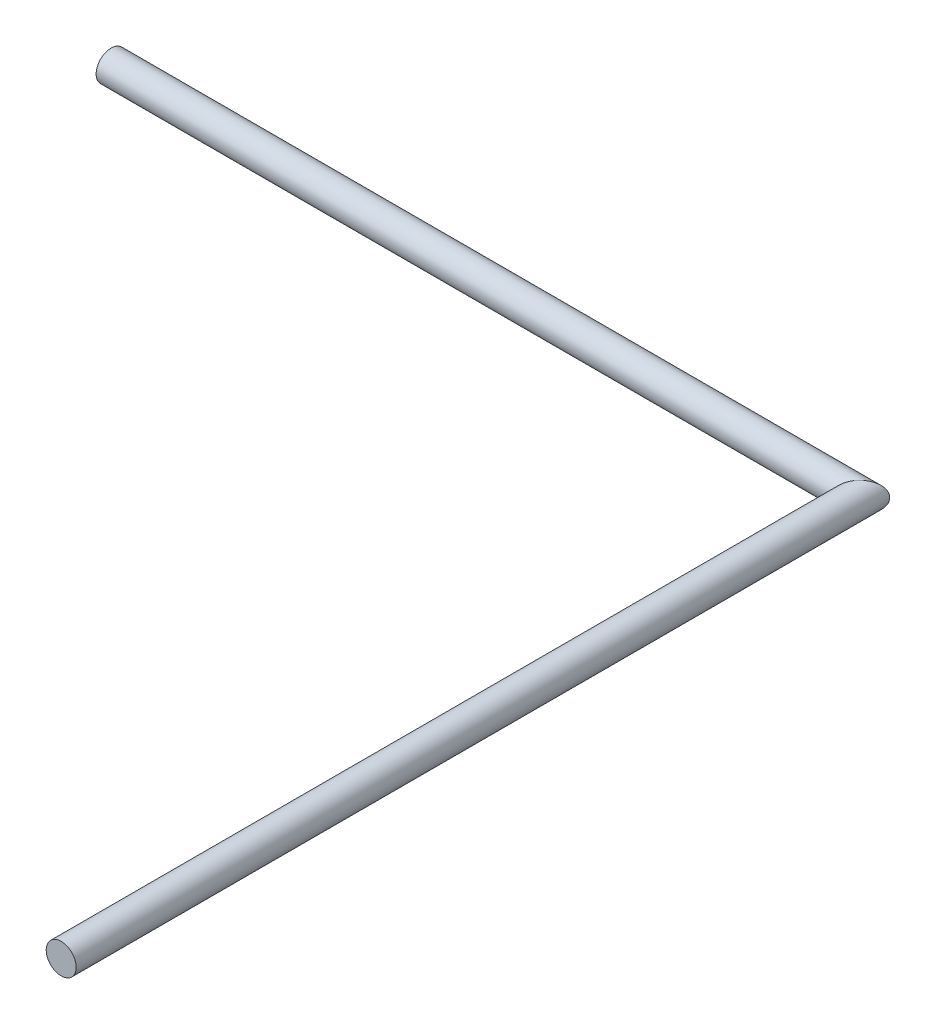
ISO-10303-21;
HEADER;
FILE_DESCRIPTION(('STEP AP214'),'2;1');
FILE_NAME('part.step','',(''),(''),'','','');
FILE_SCHEMA(('AUTOMOTIVE_DESIGN { 1 0 10303 214 1 1 1 1 }'));
ENDSEC;
DATA;
#1=APPLICATION_CONTEXT('core data for automotive mechanical design processes');
#2=APPLICATION_PROTOCOL_DEFINITION('international standard','automotive_design',2000,#1);
#3=PRODUCT_CONTEXT('',#1,'mechanical');
#4=PRODUCT('Part','Part','',(#3));
#5=PRODUCT_RELATED_PRODUCT_CATEGORY('part','',(#4));
#6=PRODUCT_DEFINITION_FORMATION('','',#4);
#7=PRODUCT_DEFINITION_CONTEXT('part definition',#1,'design');
#8=PRODUCT_DEFINITION('design','',#6,#7);
#9=PRODUCT_DEFINITION_SHAPE('','',#8);
#10=(LENGTH_UNIT() NAMED_UNIT(*) SI_UNIT(.MILLI.,.METRE.));
#11=(NAMED_UNIT(*) PLANE_ANGLE_UNIT() SI_UNIT($,.RADIAN.));
#12=(NAMED_UNIT(*) SI_UNIT($,.STERADIAN.) SOLID_ANGLE_UNIT());
#13=UNCERTAINTY_MEASURE_WITH_UNIT(LENGTH_MEASURE(1.E-05),#10,'distance_accuracy_value','');
#14=(GEOMETRIC_REPRESENTATION_CONTEXT(3) GLOBAL_UNCERTAINTY_ASSIGNED_CONTEXT((#13)) GLOBAL_UNIT_ASSIGNED_CONTEXT((#10,
#11,#12)) REPRESENTATION_CONTEXT('',''));
#15=CARTESIAN_POINT('',(0.,0.,0.));
#16=DIRECTION('',(0.,0.,1.));
#17=DIRECTION('',(1.,0.,0.));
#18=AXIS2_PLACEMENT_3D('',#15,#16,#17);
#19=CARTESIAN_POINT('',(150.,0.,160.));
#20=DIRECTION('',(0.,0.,1.));
#21=DIRECTION('',(1.,0.,0.));
#22=AXIS2_PLACEMENT_3D('',#19,#20,#21);
#23=PLANE('',#22);
#24=CARTESIAN_POINT('',(150.,0.,160.));
#25=DIRECTION('',(0.,0.,1.));
#26=DIRECTION('',(1.,0.,0.));
#27=AXIS2_PLACEMENT_3D('',#24,#25,#26);
#28=CIRCLE('',#27,3.);
#29=CARTESIAN_POINT('',(153.,0.,160.));
#30=VERTEX_POINT('',#29);
#31=EDGE_CURVE('E40',#30,#30,#28,.T.);
#32=ORIENTED_EDGE('',*,*,#31,.T.);
#33=EDGE_LOOP('',(#32));
#34=FACE_BOUND('',#33,.T.);
#35=ADVANCED_FACE('F37',(#34),#23,.T.);
#36=CARTESIAN_POINT('',(0.,0.,0.));
#37=DIRECTION('',(1.,0.,0.));
#38=DIRECTION('',(0.,0.,-1.));
#39=AXIS2_PLACEMENT_3D('',#36,#37,#38);
#40=PLANE('',#39);
#41=CARTESIAN_POINT('',(0.,0.,0.));
#42=DIRECTION('',(1.,0.,0.));
#43=DIRECTION('',(0.,0.,-1.));
#44=AXIS2_PLACEMENT_3D('',#41,#42,#43);
#45=CIRCLE('',#44,3.);
#46=CARTESIAN_POINT('',(0.,0.,-3.));
#47=VERTEX_POINT('',#46);
#48=EDGE_CURVE('E44',#47,#47,#45,.T.);
#49=ORIENTED_EDGE('',*,*,#48,.F.);
#50=EDGE_LOOP('',(#49));
#51=FACE_BOUND('',#50,.T.);
#52=ADVANCED_FACE('F58',(#51),#40,.F.);
#53=CARTESIAN_POINT('',(150.,0.,-3.4));
#54=DIRECTION('',(0.,0.,1.));
#55=DIRECTION('',(1.,0.,0.));
#56=AXIS2_PLACEMENT_3D('',#53,#54,#55);
#57=CYLINDRICAL_SURFACE('',#56,3.);
#58=CARTESIAN_POINT('',(150.,0.,0.));
#59=DIRECTION('',(0.707106781186548,0.,0.707106781186547));
#60=DIRECTION('',(0.707106781186547,0.,-0.707106781186548));
#61=AXIS2_PLACEMENT_3D('',#58,#59,#60);
#62=ELLIPSE('',#61,4.24264068711929,3.);
#63=CARTESIAN_POINT('',(153.,0.,-3.));
#64=VERTEX_POINT('',#63);
#65=EDGE_CURVE('E10',#64,#64,#62,.F.);
#66=ORIENTED_EDGE('',*,*,#65,.F.);
#67=EDGE_LOOP('',(#66));
#68=FACE_BOUND('',#67,.T.);
#69=ORIENTED_EDGE('',*,*,#31,.F.);
#70=EDGE_LOOP('',(#69));
#71=FACE_BOUND('',#70,.T.);
#72=ADVANCED_FACE('F55',(#68,#71),#57,.T.);
#73=CARTESIAN_POINT('',(0.,0.,0.));
#74=DIRECTION('',(1.,0.,0.));
#75=DIRECTION('',(0.,0.,-1.));
#76=AXIS2_PLACEMENT_3D('',#73,#74,#75);
#77=CYLINDRICAL_SURFACE('',#76,3.);
#78=ORIENTED_EDGE('',*,*,#48,.T.);
#79=EDGE_LOOP('',(#78));
#80=FACE_BOUND('',#79,.T.);
#81=ORIENTED_EDGE('',*,*,#65,.T.);
#82=EDGE_LOOP('',(#81));
#83=FACE_BOUND('',#82,.T.);
#84=ADVANCED_FACE('F57',(#80,#83),#77,.T.);
#85=CLOSED_SHELL('',(#35,#52,#72,#84));
#86=MANIFOLD_SOLID_BREP('B2',#85);
#87=ADVANCED_BREP_SHAPE_REPRESENTATION('',(#18,#86),#14);
#88=SHAPE_DEFINITION_REPRESENTATION(#9,#87);
ENDSEC;
END-ISO-10303-21;
